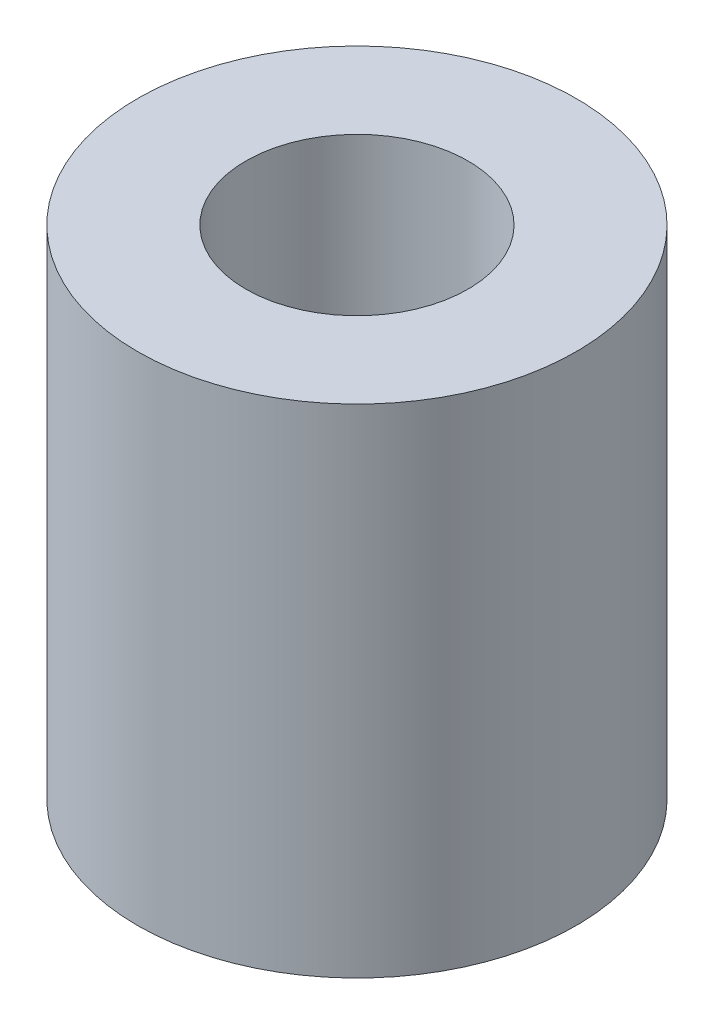
ISO-10303-21;
HEADER;
FILE_DESCRIPTION(('STEP AP214'),'2;1');
FILE_NAME('part.step','',(''),(''),'','','');
FILE_SCHEMA(('AUTOMOTIVE_DESIGN { 1 0 10303 214 1 1 1 1 }'));
ENDSEC;
DATA;
#1=APPLICATION_CONTEXT('core data for automotive mechanical design processes');
#2=APPLICATION_PROTOCOL_DEFINITION('international standard','automotive_design',2000,#1);
#3=PRODUCT_CONTEXT('',#1,'mechanical');
#4=PRODUCT('Part','Part','',(#3));
#5=PRODUCT_RELATED_PRODUCT_CATEGORY('part','',(#4));
#6=PRODUCT_DEFINITION_FORMATION('','',#4);
#7=PRODUCT_DEFINITION_CONTEXT('part definition',#1,'design');
#8=PRODUCT_DEFINITION('design','',#6,#7);
#9=PRODUCT_DEFINITION_SHAPE('','',#8);
#10=(LENGTH_UNIT() NAMED_UNIT(*) SI_UNIT(.MILLI.,.METRE.));
#11=(NAMED_UNIT(*) PLANE_ANGLE_UNIT() SI_UNIT($,.RADIAN.));
#12=(NAMED_UNIT(*) SI_UNIT($,.STERADIAN.) SOLID_ANGLE_UNIT());
#13=UNCERTAINTY_MEASURE_WITH_UNIT(LENGTH_MEASURE(1.E-05),#10,'distance_accuracy_value','');
#14=(GEOMETRIC_REPRESENTATION_CONTEXT(3) GLOBAL_UNCERTAINTY_ASSIGNED_CONTEXT((#13)) GLOBAL_UNIT_ASSIGNED_CONTEXT((#10,
#11,#12)) REPRESENTATION_CONTEXT('',''));
#15=CARTESIAN_POINT('',(0.,0.,0.));
#16=DIRECTION('',(0.,0.,1.));
#17=DIRECTION('',(1.,0.,0.));
#18=AXIS2_PLACEMENT_3D('',#15,#16,#17);
#19=CARTESIAN_POINT('',(0.,21.59,0.));
#20=DIRECTION('',(0.,1.,0.));
#21=DIRECTION('',(0.,0.,1.));
#22=AXIS2_PLACEMENT_3D('',#19,#20,#21);
#23=PLANE('',#22);
#24=CARTESIAN_POINT('',(0.,21.59,0.));
#25=DIRECTION('',(0.,1.,0.));
#26=DIRECTION('',(0.,0.,1.));
#27=AXIS2_PLACEMENT_3D('',#24,#25,#26);
#28=CIRCLE('',#27,9.525);
#29=CARTESIAN_POINT('',(0.,21.59,9.525));
#30=VERTEX_POINT('',#29);
#31=EDGE_CURVE('E10',#30,#30,#28,.T.);
#32=ORIENTED_EDGE('',*,*,#31,.T.);
#33=EDGE_LOOP('',(#32));
#34=FACE_BOUND('',#33,.T.);
#35=CARTESIAN_POINT('',(0.,21.59,0.));
#36=DIRECTION('',(0.,1.,0.));
#37=DIRECTION('',(0.,0.,1.));
#38=AXIS2_PLACEMENT_3D('',#35,#36,#37);
#39=CIRCLE('',#38,4.826);
#40=CARTESIAN_POINT('',(0.,21.59,4.826));
#41=VERTEX_POINT('',#40);
#42=EDGE_CURVE('E46',#41,#41,#39,.T.);
#43=ORIENTED_EDGE('',*,*,#42,.F.);
#44=EDGE_LOOP('',(#43));
#45=FACE_BOUND('',#44,.T.);
#46=ADVANCED_FACE('F35',(#34,#45),#23,.T.);
#47=CARTESIAN_POINT('',(0.,0.,0.));
#48=DIRECTION('',(0.,1.,0.));
#49=DIRECTION('',(0.,0.,1.));
#50=AXIS2_PLACEMENT_3D('',#47,#48,#49);
#51=PLANE('',#50);
#52=CARTESIAN_POINT('',(0.,0.,0.));
#53=DIRECTION('',(0.,1.,0.));
#54=DIRECTION('',(0.,0.,1.));
#55=AXIS2_PLACEMENT_3D('',#52,#53,#54);
#56=CIRCLE('',#55,9.525);
#57=CARTESIAN_POINT('',(0.,0.,9.525));
#58=VERTEX_POINT('',#57);
#59=EDGE_CURVE('E39',#58,#58,#56,.T.);
#60=ORIENTED_EDGE('',*,*,#59,.F.);
#61=EDGE_LOOP('',(#60));
#62=FACE_BOUND('',#61,.T.);
#63=CARTESIAN_POINT('',(0.,0.,0.));
#64=DIRECTION('',(0.,1.,0.));
#65=DIRECTION('',(0.,0.,1.));
#66=AXIS2_PLACEMENT_3D('',#63,#64,#65);
#67=CIRCLE('',#66,4.826);
#68=CARTESIAN_POINT('',(0.,0.,4.826));
#69=VERTEX_POINT('',#68);
#70=EDGE_CURVE('E48',#69,#69,#67,.T.);
#71=ORIENTED_EDGE('',*,*,#70,.T.);
#72=EDGE_LOOP('',(#71));
#73=FACE_BOUND('',#72,.T.);
#74=ADVANCED_FACE('F58',(#62,#73),#51,.F.);
#75=CARTESIAN_POINT('',(0.,21.59,0.));
#76=DIRECTION('',(0.,-1.,0.));
#77=DIRECTION('',(0.,0.,-1.));
#78=AXIS2_PLACEMENT_3D('',#75,#76,#77);
#79=CYLINDRICAL_SURFACE('',#78,9.525);
#80=ORIENTED_EDGE('',*,*,#31,.F.);
#81=EDGE_LOOP('',(#80));
#82=FACE_BOUND('',#81,.T.);
#83=ORIENTED_EDGE('',*,*,#59,.T.);
#84=EDGE_LOOP('',(#83));
#85=FACE_BOUND('',#84,.T.);
#86=ADVANCED_FACE('F37',(#82,#85),#79,.T.);
#87=CARTESIAN_POINT('',(0.,21.59,0.));
#88=DIRECTION('',(0.,-1.,0.));
#89=DIRECTION('',(0.,0.,-1.));
#90=AXIS2_PLACEMENT_3D('',#87,#88,#89);
#91=CYLINDRICAL_SURFACE('',#90,4.826);
#92=ORIENTED_EDGE('',*,*,#42,.T.);
#93=EDGE_LOOP('',(#92));
#94=FACE_BOUND('',#93,.T.);
#95=ORIENTED_EDGE('',*,*,#70,.F.);
#96=EDGE_LOOP('',(#95));
#97=FACE_BOUND('',#96,.T.);
#98=ADVANCED_FACE('F54',(#94,#97),#91,.F.);
#99=CLOSED_SHELL('',(#46,#74,#86,#98));
#100=MANIFOLD_SOLID_BREP('B2',#99);
#101=ADVANCED_BREP_SHAPE_REPRESENTATION('',(#18,#100),#14);
#102=SHAPE_DEFINITION_REPRESENTATION(#9,#101);
ENDSEC;
END-ISO-10303-21;
